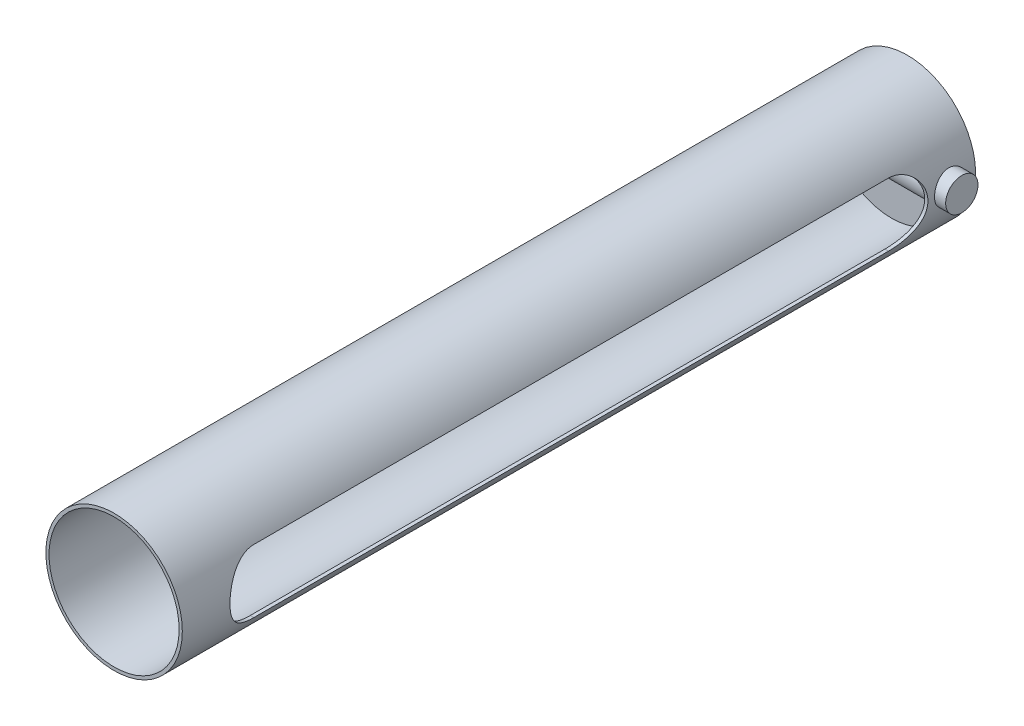
ISO-10303-21;
HEADER;
FILE_DESCRIPTION(('STEP AP214'),'2;1');
FILE_NAME('part.step','',(''),(''),'','','');
FILE_SCHEMA(('AUTOMOTIVE_DESIGN { 1 0 10303 214 1 1 1 1 }'));
ENDSEC;
DATA;
#1=APPLICATION_CONTEXT('core data for automotive mechanical design processes');
#2=APPLICATION_PROTOCOL_DEFINITION('international standard','automotive_design',2000,#1);
#3=PRODUCT_CONTEXT('',#1,'mechanical');
#4=PRODUCT('Part','Part','',(#3));
#5=PRODUCT_RELATED_PRODUCT_CATEGORY('part','',(#4));
#6=PRODUCT_DEFINITION_FORMATION('','',#4);
#7=PRODUCT_DEFINITION_CONTEXT('part definition',#1,'design');
#8=PRODUCT_DEFINITION('design','',#6,#7);
#9=PRODUCT_DEFINITION_SHAPE('','',#8);
#10=(LENGTH_UNIT() NAMED_UNIT(*) SI_UNIT(.MILLI.,.METRE.));
#11=(NAMED_UNIT(*) PLANE_ANGLE_UNIT() SI_UNIT($,.RADIAN.));
#12=(NAMED_UNIT(*) SI_UNIT($,.STERADIAN.) SOLID_ANGLE_UNIT());
#13=UNCERTAINTY_MEASURE_WITH_UNIT(LENGTH_MEASURE(1.E-05),#10,'distance_accuracy_value','');
#14=(GEOMETRIC_REPRESENTATION_CONTEXT(3) GLOBAL_UNCERTAINTY_ASSIGNED_CONTEXT((#13)) GLOBAL_UNIT_ASSIGNED_CONTEXT((#10,
#11,#12)) REPRESENTATION_CONTEXT('',''));
#15=CARTESIAN_POINT('',(0.,0.,0.));
#16=DIRECTION('',(0.,0.,1.));
#17=DIRECTION('',(1.,0.,0.));
#18=AXIS2_PLACEMENT_3D('',#15,#16,#17);
#19=CARTESIAN_POINT('',(0.,0.,127.));
#20=DIRECTION('',(0.,0.,-1.));
#21=DIRECTION('',(-1.,0.,0.));
#22=AXIS2_PLACEMENT_3D('',#19,#20,#21);
#23=CYLINDRICAL_SURFACE('',#22,10.922);
#24=CARTESIAN_POINT('',(0.,0.,0.));
#25=DIRECTION('',(0.,0.,1.));
#26=DIRECTION('',(1.,0.,0.));
#27=AXIS2_PLACEMENT_3D('',#24,#25,#26);
#28=CIRCLE('',#27,10.922);
#29=CARTESIAN_POINT('',(10.922,0.,0.));
#30=VERTEX_POINT('',#29);
#31=EDGE_CURVE('E138',#30,#30,#28,.T.);
#32=ORIENTED_EDGE('',*,*,#31,.T.);
#33=EDGE_LOOP('',(#32));
#34=FACE_BOUND('',#33,.T.);
#35=CARTESIAN_POINT('',(0.,0.,127.));
#36=DIRECTION('',(0.,0.,1.));
#37=DIRECTION('',(1.,0.,0.));
#38=AXIS2_PLACEMENT_3D('',#35,#36,#37);
#39=CIRCLE('',#38,10.922);
#40=CARTESIAN_POINT('',(10.922,0.,127.));
#41=VERTEX_POINT('',#40);
#42=EDGE_CURVE('E141',#41,#41,#39,.T.);
#43=ORIENTED_EDGE('',*,*,#42,.F.);
#44=EDGE_LOOP('',(#43));
#45=FACE_BOUND('',#44,.T.);
#46=CARTESIAN_POINT('',(9.67520714987563,5.06758824363182,114.3));
#47=CARTESIAN_POINT('',(9.6751717371054,5.06761185382101,114.434120098858));
#48=CARTESIAN_POINT('',(9.67799481494119,5.06226487315817,114.568224270448));
#49=CARTESIAN_POINT('',(9.68909535490138,5.04100955794504,114.835298143688));
#50=CARTESIAN_POINT('',(9.69736998557119,5.02510670592351,114.968268397982));
#51=CARTESIAN_POINT('',(9.71905681947539,4.98302531209526,115.231449139177));
#52=CARTESIAN_POINT('',(9.73244295290065,4.95689889627062,115.361670148469));
#53=CARTESIAN_POINT('',(9.76388412411239,4.8946779590006,115.619135575009));
#54=CARTESIAN_POINT('',(9.7819395946622,4.8585825135849,115.746379715162));
#55=CARTESIAN_POINT('',(9.82209872912603,4.77687375120811,115.996832825435));
#56=CARTESIAN_POINT('',(9.84419437411301,4.73127926336471,116.120049228634));
#57=CARTESIAN_POINT('',(9.89179106417622,4.63094348457014,116.362036249811));
#58=CARTESIAN_POINT('',(9.91729339798701,4.57619873013688,116.480805163447));
#59=CARTESIAN_POINT('',(9.99789551777869,4.39875581168349,116.829710329987));
#60=CARTESIAN_POINT('',(10.0570765710584,4.26287586971467,117.052363385912));
#61=CARTESIAN_POINT('',(10.184618910736,3.94895877959836,117.488000336633));
#62=CARTESIAN_POINT('',(10.2533327048036,3.76863955410744,117.699221881654));
#63=CARTESIAN_POINT('',(10.3893694317575,3.3755318068305,118.089840500095));
#64=CARTESIAN_POINT('',(10.4566920216104,3.16273538299387,118.269229805354));
#65=CARTESIAN_POINT('',(10.5533980452729,2.81627888827864,118.515529134732));
#66=CARTESIAN_POINT('',(10.5857085073855,2.69258780974968,118.595604575666));
#67=CARTESIAN_POINT('',(10.647192288793,2.43812947020054,118.74496420695));
#68=CARTESIAN_POINT('',(10.6763668305852,2.30736499675385,118.814252607243));
#69=CARTESIAN_POINT('',(10.7307356189495,2.03962255233995,118.941374169665));
#70=CARTESIAN_POINT('',(10.755930667658,1.90264584074095,118.99920964093));
#71=CARTESIAN_POINT('',(10.8015982843712,1.62344001817535,119.102817560938));
#72=CARTESIAN_POINT('',(10.8220712746352,1.48121137817104,119.148591088346));
#73=CARTESIAN_POINT('',(10.8565461457009,1.20169101565655,119.225043075186));
#74=CARTESIAN_POINT('',(10.8708732544951,1.0646488068353,119.256487985719));
#75=CARTESIAN_POINT('',(10.8944206465945,0.78800264457401,119.307922936573));
#76=CARTESIAN_POINT('',(10.9036413493663,0.648398902525135,119.327913917783));
#77=CARTESIAN_POINT('',(10.9167079738164,0.367815358948089,119.356187976138));
#78=CARTESIAN_POINT('',(10.920556008696,0.226836120419721,119.364475656492));
#79=CARTESIAN_POINT('',(10.9227709496161,-0.0553619456038244,119.369250165515));
#80=CARTESIAN_POINT('',(10.9211381322405,-0.196580760649634,119.365737589667));
#81=CARTESIAN_POINT('',(10.9127696159309,-0.467437399508906,119.347669100858));
#82=CARTESIAN_POINT('',(10.9064280775531,-0.597145359661095,119.333966085688));
#83=CARTESIAN_POINT('',(10.8892593375085,-0.854869140200408,119.296659833107));
#84=CARTESIAN_POINT('',(10.8784307014825,-0.982884405980616,119.273053429919));
#85=CARTESIAN_POINT('',(10.8525535360211,-1.23627311024891,119.216190340657));
#86=CARTESIAN_POINT('',(10.8375064879899,-1.36164745957526,119.182937042196));
#87=CARTESIAN_POINT('',(10.8035528451129,-1.60902367163869,119.107105036037));
#88=CARTESIAN_POINT('',(10.7846447764036,-1.73102422624729,119.064522766745));
#89=CARTESIAN_POINT('',(10.7221531000102,-2.09434341318877,118.921946414314));
#90=CARTESIAN_POINT('',(10.6731829181032,-2.32941006649838,118.807929289885));
#91=CARTESIAN_POINT('',(10.5654416605153,-2.77756185219736,118.546534735172));
#92=CARTESIAN_POINT('',(10.5066668380456,-2.99063853066119,118.399144543834));
#93=CARTESIAN_POINT('',(10.379162227833,-3.40801639483155,118.060848322298));
#94=CARTESIAN_POINT('',(10.3100109243093,-3.61006801823726,117.86732318978));
#95=CARTESIAN_POINT('',(10.1729203804278,-3.98004800647344,117.449219157718));
#96=CARTESIAN_POINT('',(10.1049820208711,-4.14795242616426,117.224618651285));
#97=CARTESIAN_POINT('',(10.0080105485836,-4.37458949866081,116.862248646182));
#98=CARTESIAN_POINT('',(9.97581912558388,-4.44730887231259,116.733875790501));
#99=CARTESIAN_POINT('',(9.91488532507908,-4.58154556575114,116.470642640964));
#100=CARTESIAN_POINT('',(9.88614143851186,-4.64306779292092,116.335785222025));
#101=CARTESIAN_POINT('',(9.83317372795858,-4.7542161416762,116.060641668598));
#102=CARTESIAN_POINT('',(9.80894293038921,-4.80386065095724,115.920364320846));
#103=CARTESIAN_POINT('',(9.76589876628433,-4.89077232611097,115.635290237005));
#104=CARTESIAN_POINT('',(9.74708301469322,-4.92804494229362,115.490495521834));
#105=CARTESIAN_POINT('',(9.71304621831183,-4.99484518462513,115.173156206473));
#106=CARTESIAN_POINT('',(9.69893831045577,-5.02206429261087,114.999990816286));
#107=CARTESIAN_POINT('',(9.68474546326537,-5.04934445828388,114.738496502891));
#108=CARTESIAN_POINT('',(9.68117598104432,-5.05617978620122,114.651000707213));
#109=CARTESIAN_POINT('',(9.67640453742345,-5.06530293453706,114.475677525819));
#110=CARTESIAN_POINT('',(9.67520340400994,-5.06758916457128,114.38785003489));
#111=CARTESIAN_POINT('',(9.67520714987564,-5.06758824363182,114.3));
#112=B_SPLINE_CURVE_WITH_KNOTS('',3,(#46,#47,#48,#49,#50,#51,#52,#53,#54,#55,#56,#57,#58,#59,
#60,#61,#62,#63,#64,#65,#66,#67,#68,#69,#70,#71,#72,#73,#74,#75,#76,#77,#78,#79,#80,#81,#82,#83,
#84,#85,#86,#87,#88,#89,#90,#91,#92,#93,#94,#95,#96,#97,#98,#99,#100,#101,#102,#103,#104,#105,
#106,#107,#108,#109,#110,#111),.UNSPECIFIED.,.F.,.F.,(4,2,2,2,2,2,2,2,2,2,2,2,2,2,2,2,2,2,2,2,2,
2,2,2,2,2,2,2,2,2,2,2,4),(0.,0.402198940156815,0.804189148738479,1.2041559249312,
1.60415978412384,2.00337816877996,2.4027480058531,3.20174588445828,4.05656610140516,
4.91159463783322,5.36365647221574,5.81554143218179,6.26733519027857,6.71908853206933,
7.1425198680118,7.5659164159574,7.98914638476132,8.41235499613945,8.80364414788418,
9.19505847691041,9.58633552249943,9.97776221004638,10.7715241221311,11.5655900637006,
12.4265168708554,13.2880453221996,13.7405801558329,14.1929161765124,14.6445473456009,
15.0959792883504,15.622253887162,15.8856296430387,16.1490974600516),.UNSPECIFIED.);
#113=CARTESIAN_POINT('',(9.67520714987563,5.06758824363182,114.3));
#114=VERTEX_POINT('',#113);
#115=CARTESIAN_POINT('',(9.67520714987563,-5.06758824363182,114.3));
#116=VERTEX_POINT('',#115);
#117=EDGE_CURVE('E128',#114,#116,#112,.T.);
#118=ORIENTED_EDGE('',*,*,#117,.F.);
#119=DIRECTION('',(0.,0.,-1.));
#120=VECTOR('',#119,1.);
#121=CARTESIAN_POINT('',(9.67520714987563,5.06758824363182,127.));
#122=LINE('',#121,#120);
#123=CARTESIAN_POINT('',(9.67520714987563,5.06758824363182,12.7));
#124=VERTEX_POINT('',#123);
#125=EDGE_CURVE('E164',#124,#114,#122,.F.);
#126=ORIENTED_EDGE('',*,*,#125,.F.);
#127=CARTESIAN_POINT('',(9.67520714987564,-5.0675882436318,12.7));
#128=CARTESIAN_POINT('',(9.67517173710541,-5.06761185382099,12.565879901142));
#129=CARTESIAN_POINT('',(9.6779948149412,-5.06226487315814,12.4317757295522));
#130=CARTESIAN_POINT('',(9.6890953549014,-5.04100955794502,12.164701856312));
#131=CARTESIAN_POINT('',(9.6973699855712,-5.02510670592349,12.0317316020182));
#132=CARTESIAN_POINT('',(9.71905681947541,-4.98302531209524,11.7685508608228));
#133=CARTESIAN_POINT('',(9.73244295290067,-4.9568988962706,11.6383298515309));
#134=CARTESIAN_POINT('',(9.7638841241124,-4.89467795900058,11.3808644249911));
#135=CARTESIAN_POINT('',(9.78193959466222,-4.85858251358487,11.2536202848379));
#136=CARTESIAN_POINT('',(9.82209872912604,-4.77687375120808,11.0031671745652));
#137=CARTESIAN_POINT('',(9.84419437411302,-4.73127926336468,10.8799507713659));
#138=CARTESIAN_POINT('',(9.89179106417624,-4.63094348457011,10.637963750189));
#139=CARTESIAN_POINT('',(9.91729339798703,-4.57619873013685,10.5191948365532));
#140=CARTESIAN_POINT('',(9.99789551777871,-4.39875581168346,10.1702896700127));
#141=CARTESIAN_POINT('',(10.0570765710584,-4.26287586971464,9.94763661408778));
#142=CARTESIAN_POINT('',(10.184618910736,-3.94895877959832,9.51199966336723));
#143=CARTESIAN_POINT('',(10.2533327048036,-3.7686395541074,9.30077811834617));
#144=CARTESIAN_POINT('',(10.3893694317575,-3.37553180683046,8.91015949990539));
#145=CARTESIAN_POINT('',(10.4566920216104,-3.16273538299383,8.73077019464611));
#146=CARTESIAN_POINT('',(10.5533980452729,-2.81627888827861,8.48447086526824));
#147=CARTESIAN_POINT('',(10.5857085073855,-2.69258780974965,8.40439542433434));
#148=CARTESIAN_POINT('',(10.647192288793,-2.43812947020051,8.25503579305048));
#149=CARTESIAN_POINT('',(10.6763668305852,-2.30736499675382,8.18574739275744));
#150=CARTESIAN_POINT('',(10.7307356189495,-2.03962255233992,8.05862583033525));
#151=CARTESIAN_POINT('',(10.755930667658,-1.90264584074092,8.00079035907028));
#152=CARTESIAN_POINT('',(10.8015982843712,-1.62344001817532,7.89718243906179));
#153=CARTESIAN_POINT('',(10.8220712746352,-1.481211378171,7.85140891165418));
#154=CARTESIAN_POINT('',(10.8565461457009,-1.20169101565651,7.77495692481439));
#155=CARTESIAN_POINT('',(10.8708732544951,-1.06464880683526,7.74351201428083));
#156=CARTESIAN_POINT('',(10.8944206465945,-0.788002644573976,7.6920770634271));
#157=CARTESIAN_POINT('',(10.9036413493663,-0.648398902525102,7.6720860822174));
#158=CARTESIAN_POINT('',(10.9167079738164,-0.367815358948057,7.6438120238617));
#159=CARTESIAN_POINT('',(10.920556008696,-0.226836120419689,7.63552434350755));
#160=CARTESIAN_POINT('',(10.9227709496161,0.0553619456038552,7.63074983448547));
#161=CARTESIAN_POINT('',(10.9211381322405,0.196580760649664,7.63426241033305));
#162=CARTESIAN_POINT('',(10.9127696159309,0.467437399508935,7.65233089914232));
#163=CARTESIAN_POINT('',(10.9064280775531,0.597145359661125,7.66603391431222));
#164=CARTESIAN_POINT('',(10.8892593375085,0.854869140200438,7.70334016689295));
#165=CARTESIAN_POINT('',(10.8784307014825,0.982884405980646,7.7269465700807));
#166=CARTESIAN_POINT('',(10.8525535360211,1.23627311024894,7.78380965934308));
#167=CARTESIAN_POINT('',(10.8375064879899,1.36164745957529,7.81706295780371));
#168=CARTESIAN_POINT('',(10.8035528451129,1.60902367163872,7.89289496396336));
#169=CARTESIAN_POINT('',(10.7846447764036,1.73102422624732,7.93547723325494));
#170=CARTESIAN_POINT('',(10.7221531000102,2.09434341318881,8.07805358568632));
#171=CARTESIAN_POINT('',(10.6731829181032,2.32941006649842,8.19207071011518));
#172=CARTESIAN_POINT('',(10.5654416605153,2.77756185219739,8.4534652648277));
#173=CARTESIAN_POINT('',(10.5066668380456,2.99063853066122,8.60085545616615));
#174=CARTESIAN_POINT('',(10.379162227833,3.40801639483158,8.93915167770203));
#175=CARTESIAN_POINT('',(10.3100109243093,3.61006801823729,9.13267681022036));
#176=CARTESIAN_POINT('',(10.1729203804278,3.98004800647347,9.55078084228162));
#177=CARTESIAN_POINT('',(10.1049820208711,4.14795242616429,9.77538134871482));
#178=CARTESIAN_POINT('',(10.0080105485835,4.37458949866083,10.1377513538175));
#179=CARTESIAN_POINT('',(9.97581912558387,4.44730887231262,10.2661242094994));
#180=CARTESIAN_POINT('',(9.91488532507907,4.58154556575117,10.5293573590358));
#181=CARTESIAN_POINT('',(9.88614143851185,4.64306779292095,10.6642147779748));
#182=CARTESIAN_POINT('',(9.83317372795857,4.75421614167623,10.9393583314021));
#183=CARTESIAN_POINT('',(9.8089429303892,4.80386065095727,11.0796356791544));
#184=CARTESIAN_POINT('',(9.76589876628432,4.890772326111,11.3647097629952));
#185=CARTESIAN_POINT('',(9.74708301469321,4.92804494229365,11.5095044781663));
#186=CARTESIAN_POINT('',(9.71304621831182,4.99484518462515,11.8268437935272));
#187=CARTESIAN_POINT('',(9.69893831045576,5.0220642926109,12.0000091837138));
#188=CARTESIAN_POINT('',(9.68474546326536,5.04934445828391,12.2615034971092));
#189=CARTESIAN_POINT('',(9.6811759810443,5.05617978620124,12.3489992927875));
#190=CARTESIAN_POINT('',(9.67640453742344,5.06530293453708,12.5243224741807));
#191=CARTESIAN_POINT('',(9.67520340400993,5.0675891645713,12.6121499651103));
#192=CARTESIAN_POINT('',(9.67520714987562,5.06758824363184,12.7));
#193=B_SPLINE_CURVE_WITH_KNOTS('',3,(#127,#128,#129,#130,#131,#132,#133,#134,#135,#136,#137,
#138,#139,#140,#141,#142,#143,#144,#145,#146,#147,#148,#149,#150,#151,#152,#153,#154,#155,#156,
#157,#158,#159,#160,#161,#162,#163,#164,#165,#166,#167,#168,#169,#170,#171,#172,#173,#174,#175,
#176,#177,#178,#179,#180,#181,#182,#183,#184,#185,#186,#187,#188,#189,#190,#191,#192),
.UNSPECIFIED.,.F.,.F.,(4,2,2,2,2,2,2,2,2,2,2,2,2,2,2,2,2,2,2,2,2,2,2,2,2,2,2,2,2,2,2,2,4),(0.,
0.402198940156814,0.804189148738472,1.2041559249312,1.60415978412384,2.00337816877997,
2.40274800585311,3.20174588445829,4.05656610140517,4.91159463783323,5.36365647221574,
5.8155414321818,6.26733519027858,6.71908853206934,7.14251986801181,7.56591641595741,
7.98914638476133,8.41235499613945,8.80364414788418,9.19505847691042,9.58633552249942,
9.97776221004638,10.7715241221311,11.5655900637006,12.4265168708554,13.2880453221996,
13.7405801558329,14.1929161765124,14.6445473456009,15.0959792883504,15.6222538871619,
15.8856296430387,16.1490974600516),.UNSPECIFIED.);
#194=CARTESIAN_POINT('',(9.67520714987564,-5.0675882436318,12.7));
#195=VERTEX_POINT('',#194);
#196=EDGE_CURVE('E159',#195,#124,#193,.T.);
#197=ORIENTED_EDGE('',*,*,#196,.F.);
#198=DIRECTION('',(0.,0.,-1.));
#199=VECTOR('',#198,1.);
#200=CARTESIAN_POINT('',(9.67520714987563,-5.06758824363182,127.));
#201=LINE('',#200,#199);
#202=EDGE_CURVE('E135',#116,#195,#201,.T.);
#203=ORIENTED_EDGE('',*,*,#202,.F.);
#204=EDGE_LOOP('',(#118,#126,#197,#203));
#205=FACE_BOUND('',#204,.T.);
#206=CARTESIAN_POINT('',(10.922,0.,6.57483798145653));
#207=CARTESIAN_POINT('',(10.9219974470163,-0.143346474148062,6.57483355893868));
#208=CARTESIAN_POINT('',(10.9191496018027,-0.286743984571299,6.56289849751423));
#209=CARTESIAN_POINT('',(10.9080645331341,-0.569444756351231,6.51553571157331));
#210=CARTESIAN_POINT('',(10.8998239167723,-0.708745382425655,6.48009319695815));
#211=CARTESIAN_POINT('',(10.8788679680123,-0.979127773026397,6.38690466606625));
#212=CARTESIAN_POINT('',(10.8661577161198,-1.11021867083465,6.32918396552363));
#213=CARTESIAN_POINT('',(10.8376238235254,-1.36085455362442,6.19316297991022));
#214=CARTESIAN_POINT('',(10.8218001553313,-1.48039943663814,6.11486251311344));
#215=CARTESIAN_POINT('',(10.788433604277,-1.70678380912678,5.93835911260027));
#216=CARTESIAN_POINT('',(10.7708663626703,-1.8133769233721,5.83984475997746));
#217=CARTESIAN_POINT('',(10.7361585264573,-2.00869272929197,5.62637757091971));
#218=CARTESIAN_POINT('',(10.7190179756489,-2.09741359303558,5.5114230550782));
#219=CARTESIAN_POINT('',(10.6868610817141,-2.25559450448541,5.26646458294664));
#220=CARTESIAN_POINT('',(10.671875791431,-2.32478462658155,5.13628187909248));
#221=CARTESIAN_POINT('',(10.6460790754225,-2.44020606831167,4.86572139145869));
#222=CARTESIAN_POINT('',(10.6352670551954,-2.48644065833793,4.72534506319638));
#223=CARTESIAN_POINT('',(10.6192905025741,-2.55380923523359,4.4410761625562));
#224=CARTESIAN_POINT('',(10.6140270690819,-2.57538339313602,4.29729358908887));
#225=CARTESIAN_POINT('',(10.6094471896836,-2.59418877343251,4.00806095597233));
#226=CARTESIAN_POINT('',(10.6101298783741,-2.59142353820006,3.86261114205183));
#227=CARTESIAN_POINT('',(10.6172759283676,-2.56198110421137,3.57750255551737));
#228=CARTESIAN_POINT('',(10.6236138624673,-2.53582271215614,3.43778657859851));
#229=CARTESIAN_POINT('',(10.6411570702285,-2.46116170032471,3.16478471096718));
#230=CARTESIAN_POINT('',(10.6523626595107,-2.4126576316338,3.03149923783385));
#231=CARTESIAN_POINT('',(10.6784972973289,-2.2942255678305,2.77372215465934));
#232=CARTESIAN_POINT('',(10.6934596582969,-2.2241045485125,2.64932274558221));
#233=CARTESIAN_POINT('',(10.725402475419,-2.06456434740786,2.41386754192808));
#234=CARTESIAN_POINT('',(10.742383251652,-1.97514210300636,2.30281386933951));
#235=CARTESIAN_POINT('',(10.7769820232244,-1.77682530892995,2.09422336310001));
#236=CARTESIAN_POINT('',(10.7946052122984,-1.66749147992968,1.99710455723263));
#237=CARTESIAN_POINT('',(10.8281101219462,-1.43388201862071,1.82250594423737));
#238=CARTESIAN_POINT('',(10.8439917992696,-1.3096060153851,1.74502662479168));
#239=CARTESIAN_POINT('',(10.8722909100746,-1.04908033518744,1.61177451062208));
#240=CARTESIAN_POINT('',(10.8846983735549,-0.912797644405066,1.55606400886293));
#241=CARTESIAN_POINT('',(10.9045780301374,-0.63244337764617,1.4684555586978));
#242=CARTESIAN_POINT('',(10.912051070278,-0.48837314306804,1.43655352323055));
#243=CARTESIAN_POINT('',(10.9210965509365,-0.200112376140974,1.39809301304648));
#244=CARTESIAN_POINT('',(10.9228016754966,-0.056001949395637,1.39096454464897));
#245=CARTESIAN_POINT('',(10.9204945166248,0.231351497121566,1.40069801931734));
#246=CARTESIAN_POINT('',(10.9164826932623,0.374594585760584,1.41755803191845));
#247=CARTESIAN_POINT('',(10.9032769047143,0.654205710357164,1.47431868419337));
#248=CARTESIAN_POINT('',(10.8941517696268,0.790639378131186,1.5139134632351));
#249=CARTESIAN_POINT('',(10.8717442405146,1.05492473129378,1.6146745511839));
#250=CARTESIAN_POINT('',(10.8584614525184,1.18277560199761,1.67584290443223));
#251=CARTESIAN_POINT('',(10.8288897803261,1.42857214414284,1.81915453118567));
#252=CARTESIAN_POINT('',(10.8125553890394,1.54632219067827,1.90162371573823));
#253=CARTESIAN_POINT('',(10.7787725686323,1.76651542004395,2.08477418569614));
#254=CARTESIAN_POINT('',(10.7613239678302,1.86895623580474,2.18545828213005));
#255=CARTESIAN_POINT('',(10.7268097285673,2.05793203022241,2.40481500800753));
#256=CARTESIAN_POINT('',(10.709760865278,2.14406918798968,2.52383353116669));
#257=CARTESIAN_POINT('',(10.6784075215954,2.29514122231108,2.7749775039568));
#258=CARTESIAN_POINT('',(10.6641029184185,2.36007704754572,2.90710236678294));
#259=CARTESIAN_POINT('',(10.6400077647651,2.46643347913512,3.17998721162814));
#260=CARTESIAN_POINT('',(10.6301907471499,2.50799230395738,3.32069086691888));
#261=CARTESIAN_POINT('',(10.6161460150669,2.56679934346736,3.60735244795704));
#262=CARTESIAN_POINT('',(10.6119172218077,2.58405225038862,3.75330935398849));
#263=CARTESIAN_POINT('',(10.609604013147,2.59353142680147,4.04230263237323));
#264=CARTESIAN_POINT('',(10.6113640562663,2.58639121256836,4.18531733081059));
#265=CARTESIAN_POINT('',(10.6204739251504,2.54872241776044,4.46804189382403));
#266=CARTESIAN_POINT('',(10.6278236595336,2.51819421953814,4.60775181238896));
#267=CARTESIAN_POINT('',(10.6472025967033,2.43494559453453,4.8792911561769));
#268=CARTESIAN_POINT('',(10.6592091050447,2.3823326951625,5.01115527646256));
#269=CARTESIAN_POINT('',(10.6865541623018,2.25649544893418,5.26427340268223));
#270=CARTESIAN_POINT('',(10.7018931260822,2.18326853545758,5.38552608493589));
#271=CARTESIAN_POINT('',(10.7346273089314,2.01624698848226,5.61706738209952));
#272=CARTESIAN_POINT('',(10.7520625221028,1.92200761708211,5.72702959102383));
#273=CARTESIAN_POINT('',(10.7867737450089,1.7165179426464,5.9297858522444));
#274=CARTESIAN_POINT('',(10.8040497165019,1.60526366083137,6.02257587773887));
#275=CARTESIAN_POINT('',(10.8368219357249,1.36677489525393,6.18977758855404));
#276=CARTESIAN_POINT('',(10.852285640506,1.23931510582854,6.2638747192397));
#277=CARTESIAN_POINT('',(10.8793555666422,0.973399641122142,6.38947296806113));
#278=CARTESIAN_POINT('',(10.8909647544233,0.834952523811535,6.44099147246418));
#279=CARTESIAN_POINT('',(10.907148183753,0.580481906060736,6.51166128070388));
#280=CARTESIAN_POINT('',(10.9126809929576,0.465745531730779,6.53530396866447));
#281=CARTESIAN_POINT('',(10.9201078327411,0.234017351616364,6.56689364786897));
#282=CARTESIAN_POINT('',(10.9220020842135,0.117025683184239,6.57484159192674));
#283=CARTESIAN_POINT('',(10.922,0.,6.57483798145653));
#284=B_SPLINE_CURVE_WITH_KNOTS('',3,(#206,#207,#208,#209,#210,#211,#212,#213,#214,#215,#216,
#217,#218,#219,#220,#221,#222,#223,#224,#225,#226,#227,#228,#229,#230,#231,#232,#233,#234,#235,
#236,#237,#238,#239,#240,#241,#242,#243,#244,#245,#246,#247,#248,#249,#250,#251,#252,#253,#254,
#255,#256,#257,#258,#259,#260,#261,#262,#263,#264,#265,#266,#267,#268,#269,#270,#271,#272,#273,
#274,#275,#276,#277,#278,#279,#280,#281,#282,#283),.UNSPECIFIED.,.T.,.F.,(4,2,2,2,2,2,2,2,2,2,2,
2,2,2,2,2,2,2,2,2,2,2,2,2,2,2,2,2,2,2,2,2,2,2,2,2,2,2,4),(0.,0.429610782043273,0.85949211746722,
1.28888639024062,1.71828445483171,2.15487545290535,2.59151108181336,3.0339148305906,
3.4762555335952,3.91057104263999,4.34482334212577,4.76967739403797,5.1945589977653,
5.62335012204279,6.05220933467911,6.49202984259112,6.93186127093226,7.37294224786272,
7.81394748955327,8.24473630380504,8.67549045243575,9.1005809010081,9.52571164255804,
9.95777810024666,10.3899112938514,10.8315156504745,11.2731002442417,11.7120457236953,
12.1509064535388,12.5784570630718,13.0060006830515,13.4314863639238,13.8570250448356,
14.2926095266769,14.7282960221032,15.1708870653962,15.6131366979886,15.9638851069066,
16.3146122215477),.UNSPECIFIED.);
#285=CARTESIAN_POINT('',(10.922,0.,6.57483798145653));
#286=VERTEX_POINT('',#285);
#287=EDGE_CURVE('E11',#286,#286,#284,.T.);
#288=ORIENTED_EDGE('',*,*,#287,.F.);
#289=EDGE_LOOP('',(#288));
#290=FACE_BOUND('',#289,.T.);
#291=ADVANCED_FACE('F35',(#34,#45,#205,#290),#23,.T.);
#292=CARTESIAN_POINT('',(0.,0.,2.54));
#293=DIRECTION('',(0.,0.,1.));
#294=DIRECTION('',(1.,0.,0.));
#295=AXIS2_PLACEMENT_3D('',#292,#293,#294);
#296=CYLINDRICAL_SURFACE('',#295,10.414);
#297=CARTESIAN_POINT('',(9.09785388940736,-5.06758824363182,114.3));
#298=CARTESIAN_POINT('',(9.09781651906929,-5.067611630472,114.433251903582));
#299=CARTESIAN_POINT('',(9.10078045340872,-5.06233326081252,114.566483159275));
#300=CARTESIAN_POINT('',(9.11242990225923,-5.04135677823079,114.831796303828));
#301=CARTESIAN_POINT('',(9.12111211367888,-5.02566468062883,114.963878811648));
#302=CARTESIAN_POINT('',(9.14385536663908,-4.9841578610491,115.22522644024));
#303=CARTESIAN_POINT('',(9.15788675158409,-4.95839893160855,115.354503013725));
#304=CARTESIAN_POINT('',(9.19081665279973,-4.89709027026487,115.61005508967));
#305=CARTESIAN_POINT('',(9.20971568593974,-4.86153949859084,115.736330271873));
#306=CARTESIAN_POINT('',(9.2727286459605,-4.74090513779729,116.108922508176));
#307=CARTESIAN_POINT('',(9.32322926920946,-4.64171818556923,116.349754540938));
#308=CARTESIAN_POINT('',(9.43547790435428,-4.40905465032261,116.811529718507));
#309=CARTESIAN_POINT('',(9.49724232964567,-4.27552791000054,117.032443126905));
#310=CARTESIAN_POINT('',(9.63084888114424,-3.9659444637476,117.466737086454));
#311=CARTESIAN_POINT('',(9.70310091374094,-3.78739967526786,117.678218414272));
#312=CARTESIAN_POINT('',(9.84624716084865,-3.39790294843456,118.069734341506));
#313=CARTESIAN_POINT('',(9.91714101699602,-3.18694258594732,118.249760740375));
#314=CARTESIAN_POINT('',(10.0193841969122,-2.84235755386903,118.498005432772));
#315=CARTESIAN_POINT('',(10.0537180111916,-2.71872228585622,118.579130612144));
#316=CARTESIAN_POINT('',(10.119107360092,-2.46420165400667,118.730582464732));
#317=CARTESIAN_POINT('',(10.1501641848196,-2.3333191744752,118.800913392494));
#318=CARTESIAN_POINT('',(10.2081018071941,-2.06515667909441,118.930089432861));
#319=CARTESIAN_POINT('',(10.2349835744945,-1.9278781583775,118.988937213234));
#320=CARTESIAN_POINT('',(10.2837770189492,-1.64788018235414,119.094509139144));
#321=CARTESIAN_POINT('',(10.3056891920856,-1.505161271679,119.141234494605));
#322=CARTESIAN_POINT('',(10.3425637095808,-1.22528449178585,119.219225147103));
#323=CARTESIAN_POINT('',(10.3578971785155,-1.0884079092734,119.251325344616));
#324=CARTESIAN_POINT('',(10.3832235352138,-0.811985613118827,119.304090612988));
#325=CARTESIAN_POINT('',(10.3932169116649,-0.672440144925193,119.32475673022));
#326=CARTESIAN_POINT('',(10.4075714434702,-0.391884908104645,119.354380862599));
#327=CARTESIAN_POINT('',(10.4119350657457,-0.250875808155592,119.363344005933));
#328=CARTESIAN_POINT('',(10.414909118999,0.0314554243682226,119.369457044295));
#329=CARTESIAN_POINT('',(10.4135198778557,0.172777538644198,119.366607612568));
#330=CARTESIAN_POINT('',(10.4053832469926,0.442845220740529,119.349861472008));
#331=CARTESIAN_POINT('',(10.399088838456,0.571663628099856,119.33689860496));
#332=CARTESIAN_POINT('',(10.381850987635,0.827666192562783,119.301212695649));
#333=CARTESIAN_POINT('',(10.370906070333,0.954849817959905,119.278486556711));
#334=CARTESIAN_POINT('',(10.3446329310215,1.20663760861301,119.223522054698));
#335=CARTESIAN_POINT('',(10.3293062562298,1.33124266774656,119.191287049119));
#336=CARTESIAN_POINT('',(10.2946322079039,1.5771497156324,119.117629275155));
#337=CARTESIAN_POINT('',(10.2752832961968,1.69845042061223,119.076202991458));
#338=CARTESIAN_POINT('',(10.2112430939137,2.05962108030607,118.93739426856));
#339=CARTESIAN_POINT('',(10.1609279131527,2.29336876728343,118.826227991484));
#340=CARTESIAN_POINT('',(10.0498927830786,2.73935524182937,118.571129088466));
#341=CARTESIAN_POINT('',(9.98916889270173,2.95158583373252,118.427184044648));
#342=CARTESIAN_POINT('',(9.85658259123942,3.3691804135013,118.095583831041));
#343=CARTESIAN_POINT('',(9.78420946251821,3.57217631488536,117.905148558698));
#344=CARTESIAN_POINT('',(9.6400656494653,3.94467944272293,117.493283753972));
#345=CARTESIAN_POINT('',(9.56829550586697,4.11415916273049,117.271829016683));
#346=CARTESIAN_POINT('',(9.46491486389632,4.344473487975,116.91301263385));
#347=CARTESIAN_POINT('',(9.43028845012523,4.41892377492167,116.785069726912));
#348=CARTESIAN_POINT('',(9.36451774933396,4.55664550693228,116.522472998796));
#349=CARTESIAN_POINT('',(9.33337193373887,4.61992186639206,116.387822161405));
#350=CARTESIAN_POINT('',(9.27574017977999,4.73457065458421,116.112853700247));
#351=CARTESIAN_POINT('',(9.24924634527446,4.78596330233232,115.972546185753));
#352=CARTESIAN_POINT('',(9.20191761217114,4.87634142408556,115.687138405225));
#353=CARTESIAN_POINT('',(9.18108024483258,4.91533231206535,115.542040261155));
#354=CARTESIAN_POINT('',(9.14217161152008,4.98739986450829,115.216369712837));
#355=CARTESIAN_POINT('',(9.12566803844866,5.01738371391195,115.034900007935));
#356=CARTESIAN_POINT('',(9.10904380405441,5.04745780686701,114.760569441221));
#357=CARTESIAN_POINT('',(9.10485749397991,5.05499894407875,114.66869723621));
#358=CARTESIAN_POINT('',(9.09925946581076,5.06506576471115,114.48455922978));
#359=CARTESIAN_POINT('',(9.09784881059835,5.0675895268309,114.392293291138));
#360=CARTESIAN_POINT('',(9.09785388940735,5.06758824363182,114.3));
#361=B_SPLINE_CURVE_WITH_KNOTS('',3,(#297,#298,#299,#300,#301,#302,#303,#304,#305,#306,#307,
#308,#309,#310,#311,#312,#313,#314,#315,#316,#317,#318,#319,#320,#321,#322,#323,#324,#325,#326,
#327,#328,#329,#330,#331,#332,#333,#334,#335,#336,#337,#338,#339,#340,#341,#342,#343,#344,#345,
#346,#347,#348,#349,#350,#351,#352,#353,#354,#355,#356,#357,#358,#359,#360),.UNSPECIFIED.,.F.,
.F.,(4,2,2,2,2,2,2,2,2,2,2,2,2,2,2,2,2,2,2,2,2,2,2,2,2,2,2,2,2,2,2,4),(0.,0.399584349992489,
0.798938087266212,1.19610921161356,1.59332252682573,2.38549385029218,3.17882887057714,
4.03342989251428,4.88825338428938,5.34318233123457,5.79793150526293,6.25257490573455,
6.70717291128249,7.13087449804461,7.55453730399747,7.97801440056245,8.40146736177875,
8.78987341661784,9.17840275559589,9.56679507224857,9.95533619096307,10.7427706819669,
11.530503981619,12.3896737974408,13.2495458268493,13.705117686948,14.1604886806155,
14.6150791071686,15.0694708095243,15.6219349056848,15.8986099714304,16.1753909638267),.UNSPECIFIED.);
#362=CARTESIAN_POINT('',(9.09785388940737,-5.06758824363182,114.3));
#363=VERTEX_POINT('',#362);
#364=CARTESIAN_POINT('',(9.09785388940734,5.06758824363184,114.3));
#365=VERTEX_POINT('',#364);
#366=EDGE_CURVE('E93',#363,#365,#361,.T.);
#367=ORIENTED_EDGE('',*,*,#366,.F.);
#368=DIRECTION('',(0.,0.,1.));
#369=VECTOR('',#368,1.);
#370=CARTESIAN_POINT('',(9.09785388940737,-5.0675882436318,2.54));
#371=LINE('',#370,#369);
#372=CARTESIAN_POINT('',(9.09785388940737,-5.0675882436318,12.7));
#373=VERTEX_POINT('',#372);
#374=EDGE_CURVE('E112',#373,#363,#371,.T.);
#375=ORIENTED_EDGE('',*,*,#374,.F.);
#376=CARTESIAN_POINT('',(9.09785388940734,5.06758824363184,12.7));
#377=CARTESIAN_POINT('',(9.09781651906928,5.06761163047203,12.5667480964184));
#378=CARTESIAN_POINT('',(9.10078045340871,5.06233326081254,12.4335168407252));
#379=CARTESIAN_POINT('',(9.11242990225922,5.04135677823082,12.1682036961716));
#380=CARTESIAN_POINT('',(9.12111211367887,5.02566468062885,12.0361211883522));
#381=CARTESIAN_POINT('',(9.14385536663906,4.98415786104913,11.7747735597602));
#382=CARTESIAN_POINT('',(9.15788675158408,4.95839893160858,11.6454969862755));
#383=CARTESIAN_POINT('',(9.19081665279972,4.89709027026489,11.38994491033));
#384=CARTESIAN_POINT('',(9.20971568593973,4.86153949859086,11.263669728127));
#385=CARTESIAN_POINT('',(9.27272864596049,4.74090513779731,10.8910774918242));
#386=CARTESIAN_POINT('',(9.32322926920945,4.64171818556926,10.6502454590619));
#387=CARTESIAN_POINT('',(9.43547790435426,4.40905465032263,10.188470281493));
#388=CARTESIAN_POINT('',(9.49724232964565,4.27552791000057,9.96755687309479));
#389=CARTESIAN_POINT('',(9.63084888114422,3.96594446374762,9.53326291354612));
#390=CARTESIAN_POINT('',(9.70310091374093,3.78739967526789,9.32178158572844));
#391=CARTESIAN_POINT('',(9.84624716084864,3.3979029484346,8.93026565849405));
#392=CARTESIAN_POINT('',(9.91714101699601,3.18694258594735,8.75023925962473));
#393=CARTESIAN_POINT('',(10.0193841969122,2.84235755386906,8.50199456722818));
#394=CARTESIAN_POINT('',(10.0537180111916,2.71872228585625,8.4208693878562));
#395=CARTESIAN_POINT('',(10.119107360092,2.4642016540067,8.26941753526797));
#396=CARTESIAN_POINT('',(10.1501641848195,2.33331917447523,8.19908660750647));
#397=CARTESIAN_POINT('',(10.2081018071941,2.06515667909444,8.06991056713929));
#398=CARTESIAN_POINT('',(10.2349835744945,1.92787815837753,8.01106278676583));
#399=CARTESIAN_POINT('',(10.2837770189492,1.64788018235416,7.90549086085637));
#400=CARTESIAN_POINT('',(10.3056891920856,1.50516127167902,7.85876550539463));
#401=CARTESIAN_POINT('',(10.3425637095808,1.22528449178587,7.7807748528971));
#402=CARTESIAN_POINT('',(10.3578971785155,1.08840790927342,7.74867465538415));
#403=CARTESIAN_POINT('',(10.3832235352138,0.811985613118846,7.69590938701184));
#404=CARTESIAN_POINT('',(10.3932169116649,0.672440144925213,7.67524326978036));
#405=CARTESIAN_POINT('',(10.4075714434702,0.391884908104665,7.64561913740148));
#406=CARTESIAN_POINT('',(10.4119350657457,0.250875808155612,7.63665599406691));
#407=CARTESIAN_POINT('',(10.414909118999,-0.0314554243682024,7.63054295570536));
#408=CARTESIAN_POINT('',(10.4135198778557,-0.172777538644177,7.63339238743171));
#409=CARTESIAN_POINT('',(10.4053832469926,-0.442845220740508,7.65013852799173));
#410=CARTESIAN_POINT('',(10.399088838456,-0.571663628099836,7.6631013950403));
#411=CARTESIAN_POINT('',(10.381850987635,-0.827666192562763,7.69878730435116));
#412=CARTESIAN_POINT('',(10.370906070333,-0.954849817959885,7.72151344328902));
#413=CARTESIAN_POINT('',(10.3446329310215,-1.20663760861299,7.77647794530164));
#414=CARTESIAN_POINT('',(10.3293062562298,-1.33124266774654,7.80871295088149));
#415=CARTESIAN_POINT('',(10.2946322079039,-1.57714971563238,7.88237072484537));
#416=CARTESIAN_POINT('',(10.2752832961969,-1.69845042061221,7.92379700854185));
#417=CARTESIAN_POINT('',(10.2112430939137,-2.05962108030605,8.06260573143995));
#418=CARTESIAN_POINT('',(10.1609279131527,-2.29336876728341,8.17377200851578));
#419=CARTESIAN_POINT('',(10.0498927830786,-2.73935524182935,8.42887091153391));
#420=CARTESIAN_POINT('',(9.98916889270174,-2.9515858337325,8.57281595535156));
#421=CARTESIAN_POINT('',(9.85658259123944,-3.36918041350127,8.90441616895919));
#422=CARTESIAN_POINT('',(9.78420946251823,-3.57217631488533,9.09485144130205));
#423=CARTESIAN_POINT('',(9.64006564946531,-3.94467944272291,9.50671624602806));
#424=CARTESIAN_POINT('',(9.56829550586698,-4.11415916273047,9.72817098331652));
#425=CARTESIAN_POINT('',(9.46491486389633,-4.34447348797498,10.0869873661496));
#426=CARTESIAN_POINT('',(9.43028845012524,-4.41892377492164,10.2149302730885));
#427=CARTESIAN_POINT('',(9.36451774933398,-4.55664550693225,10.4775270012036));
#428=CARTESIAN_POINT('',(9.33337193373888,-4.61992186639203,10.6121778385946));
#429=CARTESIAN_POINT('',(9.27574017978,-4.73457065458419,10.8871462997525));
#430=CARTESIAN_POINT('',(9.24924634527447,-4.7859633023323,11.0274538142468));
#431=CARTESIAN_POINT('',(9.20191761217115,-4.87634142408554,11.3128615947752));
#432=CARTESIAN_POINT('',(9.18108024483259,-4.91533231206533,11.4579597388453));
#433=CARTESIAN_POINT('',(9.1421716115201,-4.98739986450827,11.7836302871629));
#434=CARTESIAN_POINT('',(9.12566803844868,-5.01738371391192,11.9650999920652));
#435=CARTESIAN_POINT('',(9.10904380405443,-5.04745780686698,12.2394305587786));
#436=CARTESIAN_POINT('',(9.10485749397992,-5.05499894407873,12.3313027637901));
#437=CARTESIAN_POINT('',(9.09925946581077,-5.06506576471112,12.5154407702198));
#438=CARTESIAN_POINT('',(9.09784881059836,-5.06758952683088,12.6077067088623));
#439=CARTESIAN_POINT('',(9.09785388940737,-5.0675882436318,12.7));
#440=B_SPLINE_CURVE_WITH_KNOTS('',3,(#376,#377,#378,#379,#380,#381,#382,#383,#384,#385,#386,
#387,#388,#389,#390,#391,#392,#393,#394,#395,#396,#397,#398,#399,#400,#401,#402,#403,#404,#405,
#406,#407,#408,#409,#410,#411,#412,#413,#414,#415,#416,#417,#418,#419,#420,#421,#422,#423,#424,
#425,#426,#427,#428,#429,#430,#431,#432,#433,#434,#435,#436,#437,#438,#439),.UNSPECIFIED.,.F.,
.F.,(4,2,2,2,2,2,2,2,2,2,2,2,2,2,2,2,2,2,2,2,2,2,2,2,2,2,2,2,2,2,2,4),(0.,0.399584349992496,
0.798938087266214,1.19610921161357,1.59332252682573,2.38549385029218,3.17882887057714,
4.03342989251427,4.88825338428937,5.34318233123456,5.79793150526292,6.25257490573455,
6.7071729112825,7.13087449804462,7.55453730399748,7.97801440056245,8.40146736177876,
8.78987341661785,9.1784027555959,9.56679507224857,9.95533619096308,10.7427706819669,
11.530503981619,12.3896737974408,13.2495458268493,13.705117686948,14.1604886806155,
14.6150791071686,15.0694708095243,15.6219349056848,15.8986099714304,16.1753909638267),.UNSPECIFIED.);
#441=CARTESIAN_POINT('',(9.09785388940734,5.06758824363184,12.7));
#442=VERTEX_POINT('',#441);
#443=EDGE_CURVE('E147',#442,#373,#440,.T.);
#444=ORIENTED_EDGE('',*,*,#443,.F.);
#445=DIRECTION('',(0.,0.,1.));
#446=VECTOR('',#445,1.);
#447=CARTESIAN_POINT('',(9.09785388940734,5.06758824363184,2.54));
#448=LINE('',#447,#446);
#449=EDGE_CURVE('E144',#365,#442,#448,.F.);
#450=ORIENTED_EDGE('',*,*,#449,.F.);
#451=EDGE_LOOP('',(#367,#375,#444,#450));
#452=FACE_BOUND('',#451,.T.);
#453=CARTESIAN_POINT('',(0.,0.,127.));
#454=DIRECTION('',(0.,0.,1.));
#455=DIRECTION('',(1.,0.,0.));
#456=AXIS2_PLACEMENT_3D('',#453,#454,#455);
#457=CIRCLE('',#456,10.414);
#458=CARTESIAN_POINT('',(10.414,0.,127.));
#459=VERTEX_POINT('',#458);
#460=EDGE_CURVE('E134',#459,#459,#457,.T.);
#461=ORIENTED_EDGE('',*,*,#460,.T.);
#462=EDGE_LOOP('',(#461));
#463=FACE_BOUND('',#462,.T.);
#464=CARTESIAN_POINT('',(10.1896453299117,-2.15000559315768,2.54));
#465=CARTESIAN_POINT('',(10.181234209859,-2.18986272444875,2.59932279524912));
#466=CARTESIAN_POINT('',(10.1730994080977,-2.2272662678784,2.66029527608818));
#467=CARTESIAN_POINT('',(10.1575938882262,-2.29694571884191,2.78520351364464));
#468=CARTESIAN_POINT('',(10.1502232513308,-2.32922108154941,2.84913958428785));
#469=CARTESIAN_POINT('',(10.129587939436,-2.4179670802745,3.04477001959303));
#470=CARTESIAN_POINT('',(10.1177863967005,-2.46641905573595,3.18037807575441));
#471=CARTESIAN_POINT('',(10.0994981363819,-2.54027547794488,3.45820698807448));
#472=CARTESIAN_POINT('',(10.093018161227,-2.56565069078031,3.60043599276113));
#473=CARTESIAN_POINT('',(10.0861784416905,-2.59241177981472,3.88721201003686));
#474=CARTESIAN_POINT('',(10.0858146454636,-2.5938135379549,4.03175742450554));
#475=CARTESIAN_POINT('',(10.0911957106482,-2.57279438906678,4.31644579642282));
#476=CARTESIAN_POINT('',(10.0968346723455,-2.55078647697483,4.45662162266051));
#477=CARTESIAN_POINT('',(10.1133930038482,-2.48431841532665,4.73125329805422));
#478=CARTESIAN_POINT('',(10.1243141229928,-2.43985082738338,4.86570723618056));
#479=CARTESIAN_POINT('',(10.1502834343231,-2.32945496870883,5.12615165267216));
#480=CARTESIAN_POINT('',(10.1653595409803,-2.26338095854369,5.25207744176838));
#481=CARTESIAN_POINT('',(10.1979372706887,-2.11174497893209,5.49123075572295));
#482=CARTESIAN_POINT('',(10.2154390796536,-2.02618151542573,5.60445730606503));
#483=CARTESIAN_POINT('',(10.2515111778522,-1.83510549328536,5.81841632860207));
#484=CARTESIAN_POINT('',(10.2700977015234,-1.72909418187218,5.91870112523643));
#485=CARTESIAN_POINT('',(10.3058156182557,-1.50159847716259,6.100188987088));
#486=CARTESIAN_POINT('',(10.3229468940855,-1.38011283925796,6.18139051593169));
#487=CARTESIAN_POINT('',(10.3539659834108,-1.12405533559889,6.32283904258274));
#488=CARTESIAN_POINT('',(10.3678321029243,-0.98940391519478,6.38294711843068));
#489=CARTESIAN_POINT('',(10.3906011820151,-0.71148748919057,6.47954504900542));
#490=CARTESIAN_POINT('',(10.3995050783793,-0.568224115048362,6.51603936183531));
#491=CARTESIAN_POINT('',(10.4111809497673,-0.280859777850524,6.56358160569949));
#492=CARTESIAN_POINT('',(10.4140960147782,-0.136862865242129,6.57522360098905));
#493=CARTESIAN_POINT('',(10.413899152546,0.151051286419464,6.57443293222677));
#494=CARTESIAN_POINT('',(10.4107878640757,0.294968532299656,6.562002819736));
#495=CARTESIAN_POINT('',(10.3989901437543,0.576081691051562,6.51391929013606));
#496=CARTESIAN_POINT('',(10.3903996257889,0.713350350607154,6.47866524917063));
#497=CARTESIAN_POINT('',(10.3686502669784,0.979998861848729,6.38644203846832));
#498=CARTESIAN_POINT('',(10.3554909983741,1.10937797352473,6.32947083536605));
#499=CARTESIAN_POINT('',(10.3257506759556,1.35878550210944,6.19445458924126));
#500=CARTESIAN_POINT('',(10.3091203212754,1.47864044355492,6.11610027354438));
#501=CARTESIAN_POINT('',(10.2743247719502,1.70371279011198,5.94088541313855));
#502=CARTESIAN_POINT('',(10.2561593506646,1.80892802769605,5.8440221330545));
#503=CARTESIAN_POINT('',(10.2197606420188,2.00450764135597,5.63161517376694));
#504=CARTESIAN_POINT('',(10.201537321392,2.09442761200543,5.51565997308053));
#505=CARTESIAN_POINT('',(10.1675685327646,2.25357316076336,5.26997239280706));
#506=CARTESIAN_POINT('',(10.1518232456641,2.3227972283719,5.14023900854904));
#507=CARTESIAN_POINT('',(10.1247080274386,2.43828074171242,4.87091151621929));
#508=CARTESIAN_POINT('',(10.1133259409294,2.48460409222891,4.73134610401856));
#509=CARTESIAN_POINT('',(10.0962760110585,2.55301170800847,4.44610768045271));
#510=CARTESIAN_POINT('',(10.0906054340564,2.57510756947141,4.30043762569684));
#511=CARTESIAN_POINT('',(10.0857562434972,2.59403294866624,4.0115154894829));
#512=CARTESIAN_POINT('',(10.0863980971836,2.59156117628024,3.86831197765217));
#513=CARTESIAN_POINT('',(10.0936633967798,2.56311651445514,3.58436143591937));
#514=CARTESIAN_POINT('',(10.1002898355067,2.5371318665048,3.44361567100734));
#515=CARTESIAN_POINT('',(10.1186759819309,2.46276869759989,3.16966293822725));
#516=CARTESIAN_POINT('',(10.1303951019616,2.41456706112829,3.03640558286167));
#517=CARTESIAN_POINT('',(10.1507962441438,2.32671898930787,2.844092447919));
#518=CARTESIAN_POINT('',(10.1580702769009,2.29483055867826,2.78122817664856));
#519=CARTESIAN_POINT('',(10.1733555049133,2.22608856104824,2.65837652201434));
#520=CARTESIAN_POINT('',(10.1813666309741,2.18923545995569,2.59838886941067));
#521=CARTESIAN_POINT('',(10.1896453299117,2.15000559315768,2.54));
#522=B_SPLINE_CURVE_WITH_KNOTS('',3,(#464,#465,#466,#467,#468,#469,#470,#471,#472,#473,#474,
#475,#476,#477,#478,#479,#480,#481,#482,#483,#484,#485,#486,#487,#488,#489,#490,#491,#492,#493,
#494,#495,#496,#497,#498,#499,#500,#501,#502,#503,#504,#505,#506,#507,#508,#509,#510,#511,#512,
#513,#514,#515,#516,#517,#518,#519,#520,#521),.UNSPECIFIED.,.F.,.F.,(4,2,2,2,2,2,2,2,2,2,2,2,2,
2,2,2,2,2,2,2,2,2,2,2,2,2,2,2,4),(0.,0.215760563256208,0.43154403396476,0.862782110147295,
1.29456572583856,1.72606328230691,2.15007265631021,2.57422254952543,3.00129455676404,
3.42839931433311,3.86766812773266,4.30697229408962,4.74911769981536,5.19117960739772,
5.62255044273827,6.05387555674854,6.47785012827164,6.90186440604399,7.33237003558742,
7.76293933732771,8.20443044753813,8.64595377231651,9.08623796554899,9.52631132986526,
9.95390553589941,10.3817136949926,10.8061731037452,11.018561371764,11.2309297221426),.UNSPECIFIED.);
#523=CARTESIAN_POINT('',(10.1896453299117,-2.15000559315768,2.54));
#524=VERTEX_POINT('',#523);
#525=CARTESIAN_POINT('',(10.1896453299117,2.15000559315768,2.54));
#526=VERTEX_POINT('',#525);
#527=EDGE_CURVE('E174',#524,#526,#522,.T.);
#528=ORIENTED_EDGE('',*,*,#527,.F.);
#529=CARTESIAN_POINT('',(0.,0.,2.54));
#530=DIRECTION('',(0.,0.,1.));
#531=DIRECTION('',(1.,0.,0.));
#532=AXIS2_PLACEMENT_3D('',#529,#530,#531);
#533=CIRCLE('',#532,10.414);
#534=EDGE_CURVE('E103',#526,#524,#533,.T.);
#535=ORIENTED_EDGE('',*,*,#534,.F.);
#536=EDGE_LOOP('',(#528,#535));
#537=FACE_BOUND('',#536,.T.);
#538=ADVANCED_FACE('F114',(#452,#463,#537),#296,.F.);
#539=CARTESIAN_POINT('',(0.,0.,2.54));
#540=DIRECTION('',(0.,0.,1.));
#541=DIRECTION('',(1.,0.,0.));
#542=AXIS2_PLACEMENT_3D('',#539,#540,#541);
#543=PLANE('',#542);
#544=DIRECTION('',(0.,1.,0.));
#545=VECTOR('',#544,1.);
#546=CARTESIAN_POINT('',(0.,0.,2.54));
#547=LINE('',#546,#545);
#548=CARTESIAN_POINT('',(0.,-2.15000559315768,2.54));
#549=VERTEX_POINT('',#548);
#550=CARTESIAN_POINT('',(0.,2.15000559315768,2.54));
#551=VERTEX_POINT('',#550);
#552=EDGE_CURVE('E87',#549,#551,#547,.T.);
#553=ORIENTED_EDGE('',*,*,#552,.T.);
#554=DIRECTION('',(-1.,0.,0.));
#555=VECTOR('',#554,1.);
#556=CARTESIAN_POINT('',(12.7,2.15000559315768,2.54));
#557=LINE('',#556,#555);
#558=EDGE_CURVE('E39',#551,#526,#557,.F.);
#559=ORIENTED_EDGE('',*,*,#558,.T.);
#560=ORIENTED_EDGE('',*,*,#534,.T.);
#561=DIRECTION('',(-1.,0.,0.));
#562=VECTOR('',#561,1.);
#563=CARTESIAN_POINT('',(12.7,-2.15000559315768,2.54));
#564=LINE('',#563,#562);
#565=EDGE_CURVE('E92',#524,#549,#564,.T.);
#566=ORIENTED_EDGE('',*,*,#565,.T.);
#567=EDGE_LOOP('',(#553,#559,#560,#566));
#568=FACE_BOUND('',#567,.T.);
#569=ADVANCED_FACE('F101',(#568),#543,.T.);
#570=CARTESIAN_POINT('',(0.,0.,127.));
#571=DIRECTION('',(0.,0.,1.));
#572=DIRECTION('',(1.,0.,0.));
#573=AXIS2_PLACEMENT_3D('',#570,#571,#572);
#574=PLANE('',#573);
#575=ORIENTED_EDGE('',*,*,#460,.F.);
#576=EDGE_LOOP('',(#575));
#577=FACE_BOUND('',#576,.T.);
#578=ORIENTED_EDGE('',*,*,#42,.T.);
#579=EDGE_LOOP('',(#578));
#580=FACE_BOUND('',#579,.T.);
#581=ADVANCED_FACE('F266',(#577,#580),#574,.T.);
#582=CARTESIAN_POINT('',(0.,0.,0.));
#583=DIRECTION('',(0.,0.,1.));
#584=DIRECTION('',(1.,0.,0.));
#585=AXIS2_PLACEMENT_3D('',#582,#583,#584);
#586=PLANE('',#585);
#587=ORIENTED_EDGE('',*,*,#31,.F.);
#588=EDGE_LOOP('',(#587));
#589=FACE_BOUND('',#588,.T.);
#590=ADVANCED_FACE('F123',(#589),#586,.F.);
#591=CARTESIAN_POINT('',(15.24,0.,114.3));
#592=DIRECTION('',(-1.,0.,0.));
#593=DIRECTION('',(0.,0.,1.));
#594=AXIS2_PLACEMENT_3D('',#591,#592,#593);
#595=CYLINDRICAL_SURFACE('',#594,5.06758824363182);
#596=ORIENTED_EDGE('',*,*,#117,.T.);
#597=DIRECTION('',(-1.,0.,0.));
#598=VECTOR('',#597,1.);
#599=CARTESIAN_POINT('',(15.24,-5.06758824363182,114.3));
#600=LINE('',#599,#598);
#601=EDGE_CURVE('E166',#116,#363,#600,.T.);
#602=ORIENTED_EDGE('',*,*,#601,.T.);
#603=ORIENTED_EDGE('',*,*,#366,.T.);
#604=DIRECTION('',(-1.,0.,0.));
#605=VECTOR('',#604,1.);
#606=CARTESIAN_POINT('',(15.24,5.06758824363182,114.3));
#607=LINE('',#606,#605);
#608=EDGE_CURVE('E173',#114,#365,#607,.T.);
#609=ORIENTED_EDGE('',*,*,#608,.F.);
#610=EDGE_LOOP('',(#596,#602,#603,#609));
#611=FACE_BOUND('',#610,.T.);
#612=ADVANCED_FACE('F118',(#611),#595,.F.);
#613=CARTESIAN_POINT('',(15.24,-5.06758824363182,114.3));
#614=DIRECTION('',(0.,1.,0.));
#615=DIRECTION('',(0.,0.,1.));
#616=AXIS2_PLACEMENT_3D('',#613,#614,#615);
#617=PLANE('',#616);
#618=ORIENTED_EDGE('',*,*,#202,.T.);
#619=DIRECTION('',(-1.,0.,0.));
#620=VECTOR('',#619,1.);
#621=CARTESIAN_POINT('',(15.24,-5.0675882436318,12.7));
#622=LINE('',#621,#620);
#623=EDGE_CURVE('E169',#195,#373,#622,.T.);
#624=ORIENTED_EDGE('',*,*,#623,.T.);
#625=ORIENTED_EDGE('',*,*,#374,.T.);
#626=ORIENTED_EDGE('',*,*,#601,.F.);
#627=EDGE_LOOP('',(#618,#624,#625,#626));
#628=FACE_BOUND('',#627,.T.);
#629=ADVANCED_FACE('F122',(#628),#617,.T.);
#630=CARTESIAN_POINT('',(15.24,0.,12.7));
#631=DIRECTION('',(-1.,0.,0.));
#632=DIRECTION('',(0.,0.,1.));
#633=AXIS2_PLACEMENT_3D('',#630,#631,#632);
#634=CYLINDRICAL_SURFACE('',#633,5.06758824363182);
#635=ORIENTED_EDGE('',*,*,#196,.T.);
#636=DIRECTION('',(-1.,0.,0.));
#637=VECTOR('',#636,1.);
#638=CARTESIAN_POINT('',(15.24,5.06758824363184,12.7));
#639=LINE('',#638,#637);
#640=EDGE_CURVE('E58',#124,#442,#639,.T.);
#641=ORIENTED_EDGE('',*,*,#640,.T.);
#642=ORIENTED_EDGE('',*,*,#443,.T.);
#643=ORIENTED_EDGE('',*,*,#623,.F.);
#644=EDGE_LOOP('',(#635,#641,#642,#643));
#645=FACE_BOUND('',#644,.T.);
#646=ADVANCED_FACE('F151',(#645),#634,.F.);
#647=CARTESIAN_POINT('',(15.24,5.06758824363182,114.3));
#648=DIRECTION('',(0.,-1.,0.));
#649=DIRECTION('',(0.,0.,-1.));
#650=AXIS2_PLACEMENT_3D('',#647,#648,#649);
#651=PLANE('',#650);
#652=ORIENTED_EDGE('',*,*,#125,.T.);
#653=ORIENTED_EDGE('',*,*,#608,.T.);
#654=ORIENTED_EDGE('',*,*,#449,.T.);
#655=ORIENTED_EDGE('',*,*,#640,.F.);
#656=EDGE_LOOP('',(#652,#653,#654,#655));
#657=FACE_BOUND('',#656,.T.);
#658=ADVANCED_FACE('F155',(#657),#651,.T.);
#659=CARTESIAN_POINT('',(0.,0.,3.98459251394609));
#660=DIRECTION('',(1.,0.,0.));
#661=DIRECTION('',(0.,0.,-1.));
#662=AXIS2_PLACEMENT_3D('',#659,#660,#661);
#663=PLANE('',#662);
#664=ORIENTED_EDGE('',*,*,#552,.F.);
#665=CARTESIAN_POINT('',(0.,0.,3.98459251394609));
#666=DIRECTION('',(1.,0.,0.));
#667=DIRECTION('',(0.,0.,-1.));
#668=AXIS2_PLACEMENT_3D('',#665,#666,#667);
#669=CIRCLE('',#668,2.59024546751044);
#670=EDGE_CURVE('E50',#551,#549,#669,.T.);
#671=ORIENTED_EDGE('',*,*,#670,.F.);
#672=EDGE_LOOP('',(#664,#671));
#673=FACE_BOUND('',#672,.T.);
#674=ADVANCED_FACE('F88',(#673),#663,.F.);
#675=CARTESIAN_POINT('',(12.7,0.,3.98459251394609));
#676=DIRECTION('',(-1.,0.,0.));
#677=DIRECTION('',(0.,0.,1.));
#678=AXIS2_PLACEMENT_3D('',#675,#676,#677);
#679=CYLINDRICAL_SURFACE('',#678,2.59024546751044);
#680=ORIENTED_EDGE('',*,*,#558,.F.);
#681=ORIENTED_EDGE('',*,*,#670,.T.);
#682=ORIENTED_EDGE('',*,*,#565,.F.);
#683=ORIENTED_EDGE('',*,*,#527,.T.);
#684=EDGE_LOOP('',(#680,#681,#682,#683));
#685=FACE_BOUND('',#684,.T.);
#686=ADVANCED_FACE('F96',(#685),#679,.T.);
#687=CARTESIAN_POINT('',(12.7,0.,3.98459251394609));
#688=DIRECTION('',(1.,0.,0.));
#689=DIRECTION('',(0.,0.,-1.));
#690=AXIS2_PLACEMENT_3D('',#687,#688,#689);
#691=CIRCLE('',#690,2.59024546751044);
#692=CARTESIAN_POINT('',(12.7,0.,1.39434704643564));
#693=VERTEX_POINT('',#692);
#694=EDGE_CURVE('E98',#693,#693,#691,.T.);
#695=ORIENTED_EDGE('',*,*,#694,.F.);
#696=EDGE_LOOP('',(#695));
#697=FACE_BOUND('',#696,.T.);
#698=ORIENTED_EDGE('',*,*,#287,.T.);
#699=EDGE_LOOP('',(#698));
#700=FACE_BOUND('',#699,.T.);
#701=ADVANCED_FACE('F184',(#697,#700),#679,.T.);
#702=CARTESIAN_POINT('',(12.7,0.,3.98459251394609));
#703=DIRECTION('',(1.,0.,0.));
#704=DIRECTION('',(0.,0.,-1.));
#705=AXIS2_PLACEMENT_3D('',#702,#703,#704);
#706=PLANE('',#705);
#707=ORIENTED_EDGE('',*,*,#694,.T.);
#708=EDGE_LOOP('',(#707));
#709=FACE_BOUND('',#708,.T.);
#710=ADVANCED_FACE('F188',(#709),#706,.T.);
#711=CLOSED_SHELL('',(#291,#538,#569,#581,#590,#612,#629,#646,#658,#674,#686,#701,#710));
#712=MANIFOLD_SOLID_BREP('B2',#711);
#713=ADVANCED_BREP_SHAPE_REPRESENTATION('',(#18,#712),#14);
#714=SHAPE_DEFINITION_REPRESENTATION(#9,#713);
ENDSEC;
END-ISO-10303-21;
